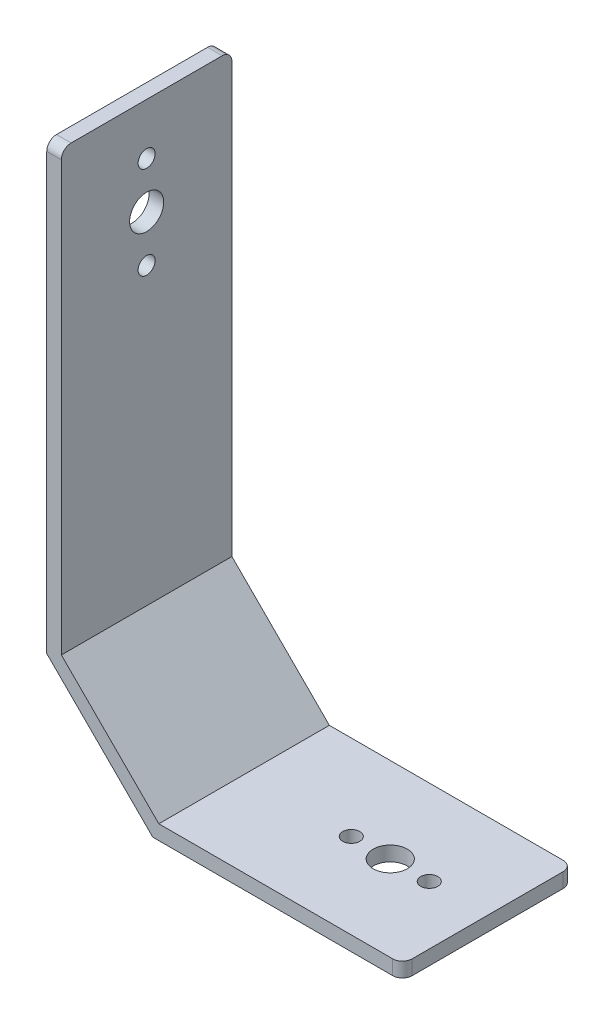
ISO-10303-21;
HEADER;
FILE_DESCRIPTION(('STEP AP214'),'2;1');
FILE_NAME('part.step','',(''),(''),'','','');
FILE_SCHEMA(('AUTOMOTIVE_DESIGN { 1 0 10303 214 1 1 1 1 }'));
ENDSEC;
DATA;
#1=APPLICATION_CONTEXT('core data for automotive mechanical design processes');
#2=APPLICATION_PROTOCOL_DEFINITION('international standard','automotive_design',2000,#1);
#3=PRODUCT_CONTEXT('',#1,'mechanical');
#4=PRODUCT('Part','Part','',(#3));
#5=PRODUCT_RELATED_PRODUCT_CATEGORY('part','',(#4));
#6=PRODUCT_DEFINITION_FORMATION('','',#4);
#7=PRODUCT_DEFINITION_CONTEXT('part definition',#1,'design');
#8=PRODUCT_DEFINITION('design','',#6,#7);
#9=PRODUCT_DEFINITION_SHAPE('','',#8);
#10=(LENGTH_UNIT() NAMED_UNIT(*) SI_UNIT(.MILLI.,.METRE.));
#11=(NAMED_UNIT(*) PLANE_ANGLE_UNIT() SI_UNIT($,.RADIAN.));
#12=(NAMED_UNIT(*) SI_UNIT($,.STERADIAN.) SOLID_ANGLE_UNIT());
#13=UNCERTAINTY_MEASURE_WITH_UNIT(LENGTH_MEASURE(1.E-05),#10,'distance_accuracy_value','');
#14=(GEOMETRIC_REPRESENTATION_CONTEXT(3) GLOBAL_UNCERTAINTY_ASSIGNED_CONTEXT((#13)) GLOBAL_UNIT_ASSIGNED_CONTEXT((#10,
#11,#12)) REPRESENTATION_CONTEXT('',''));
#15=CARTESIAN_POINT('',(0.,0.,0.));
#16=DIRECTION('',(0.,0.,1.));
#17=DIRECTION('',(1.,0.,0.));
#18=AXIS2_PLACEMENT_3D('',#15,#16,#17);
#19=CARTESIAN_POINT('',(20.,-23.,35.));
#20=DIRECTION('',(0.,1.,0.));
#21=DIRECTION('',(0.,0.,1.));
#22=AXIS2_PLACEMENT_3D('',#19,#20,#21);
#23=PLANE('',#22);
#24=CARTESIAN_POINT('',(50.,-23.,17.5));
#25=DIRECTION('',(0.,1.,0.));
#26=DIRECTION('',(0.,0.,1.));
#27=AXIS2_PLACEMENT_3D('',#24,#25,#26);
#28=CIRCLE('',#27,3.5);
#29=CARTESIAN_POINT('',(50.,-23.,21.));
#30=VERTEX_POINT('',#29);
#31=EDGE_CURVE('E312',#30,#30,#28,.T.);
#32=ORIENTED_EDGE('',*,*,#31,.T.);
#33=EDGE_LOOP('',(#32));
#34=FACE_BOUND('',#33,.T.);
#35=CARTESIAN_POINT('',(42.,-23.,17.5));
#36=DIRECTION('',(0.,1.,0.));
#37=DIRECTION('',(0.,0.,1.));
#38=AXIS2_PLACEMENT_3D('',#35,#36,#37);
#39=CIRCLE('',#38,1.75);
#40=CARTESIAN_POINT('',(42.,-23.,19.25));
#41=VERTEX_POINT('',#40);
#42=EDGE_CURVE('E306',#41,#41,#39,.T.);
#43=ORIENTED_EDGE('',*,*,#42,.T.);
#44=EDGE_LOOP('',(#43));
#45=FACE_BOUND('',#44,.T.);
#46=CARTESIAN_POINT('',(58.,-23.,17.5));
#47=DIRECTION('',(0.,1.,0.));
#48=DIRECTION('',(0.,0.,1.));
#49=AXIS2_PLACEMENT_3D('',#46,#47,#48);
#50=CIRCLE('',#49,1.75);
#51=CARTESIAN_POINT('',(58.,-23.,19.25));
#52=VERTEX_POINT('',#51);
#53=EDGE_CURVE('E299',#52,#52,#50,.T.);
#54=ORIENTED_EDGE('',*,*,#53,.T.);
#55=EDGE_LOOP('',(#54));
#56=FACE_BOUND('',#55,.T.);
#57=DIRECTION('',(1.,0.,0.));
#58=VECTOR('',#57,1.);
#59=CARTESIAN_POINT('',(20.,-23.,0.));
#60=LINE('',#59,#58);
#61=CARTESIAN_POINT('',(18.7573593128807,-23.,0.));
#62=VERTEX_POINT('',#61);
#63=CARTESIAN_POINT('',(68.,-23.,0.));
#64=VERTEX_POINT('',#63);
#65=EDGE_CURVE('E158',#62,#64,#60,.T.);
#66=ORIENTED_EDGE('',*,*,#65,.T.);
#67=CARTESIAN_POINT('',(68.,-23.,2.));
#68=DIRECTION('',(0.,1.,0.));
#69=DIRECTION('',(0.,0.,1.));
#70=AXIS2_PLACEMENT_3D('',#67,#68,#69);
#71=CIRCLE('',#70,2.);
#72=CARTESIAN_POINT('',(70.,-23.,2.));
#73=VERTEX_POINT('',#72);
#74=EDGE_CURVE('E54',#64,#73,#71,.F.);
#75=ORIENTED_EDGE('',*,*,#74,.T.);
#76=DIRECTION('',(0.,0.,-1.));
#77=VECTOR('',#76,1.);
#78=CARTESIAN_POINT('',(70.,-23.,35.));
#79=LINE('',#78,#77);
#80=CARTESIAN_POINT('',(70.,-23.,33.));
#81=VERTEX_POINT('',#80);
#82=EDGE_CURVE('E183',#81,#73,#79,.T.);
#83=ORIENTED_EDGE('',*,*,#82,.F.);
#84=CARTESIAN_POINT('',(68.,-23.,33.));
#85=DIRECTION('',(0.,1.,0.));
#86=DIRECTION('',(0.,0.,1.));
#87=AXIS2_PLACEMENT_3D('',#84,#85,#86);
#88=CIRCLE('',#87,2.);
#89=CARTESIAN_POINT('',(68.,-23.,35.));
#90=VERTEX_POINT('',#89);
#91=EDGE_CURVE('E206',#81,#90,#88,.F.);
#92=ORIENTED_EDGE('',*,*,#91,.T.);
#93=DIRECTION('',(1.,0.,0.));
#94=VECTOR('',#93,1.);
#95=CARTESIAN_POINT('',(20.,-23.,35.));
#96=LINE('',#95,#94);
#97=CARTESIAN_POINT('',(18.7573593128807,-23.,35.));
#98=VERTEX_POINT('',#97);
#99=EDGE_CURVE('E143',#98,#90,#96,.T.);
#100=ORIENTED_EDGE('',*,*,#99,.F.);
#101=DIRECTION('',(0.,0.,-1.));
#102=VECTOR('',#101,1.);
#103=CARTESIAN_POINT('',(18.7573593128807,-23.,35.));
#104=LINE('',#103,#102);
#105=EDGE_CURVE('E157',#98,#62,#104,.T.);
#106=ORIENTED_EDGE('',*,*,#105,.T.);
#107=EDGE_LOOP('',(#66,#75,#83,#92,#100,#106));
#108=FACE_BOUND('',#107,.T.);
#109=ADVANCED_FACE('F32',(#34,#45,#56,#108),#23,.F.);
#110=CARTESIAN_POINT('',(70.,-20.,35.));
#111=DIRECTION('',(1.,0.,0.));
#112=DIRECTION('',(0.,0.,-1.));
#113=AXIS2_PLACEMENT_3D('',#110,#111,#112);
#114=PLANE('',#113);
#115=ORIENTED_EDGE('',*,*,#82,.T.);
#116=DIRECTION('',(0.,-1.,0.));
#117=VECTOR('',#116,1.);
#118=CARTESIAN_POINT('',(70.,-20.,2.));
#119=LINE('',#118,#117);
#120=CARTESIAN_POINT('',(70.,-20.,2.));
#121=VERTEX_POINT('',#120);
#122=EDGE_CURVE('E40',#73,#121,#119,.F.);
#123=ORIENTED_EDGE('',*,*,#122,.T.);
#124=DIRECTION('',(0.,0.,-1.));
#125=VECTOR('',#124,1.);
#126=CARTESIAN_POINT('',(70.,-20.,35.));
#127=LINE('',#126,#125);
#128=CARTESIAN_POINT('',(70.,-20.,33.));
#129=VERTEX_POINT('',#128);
#130=EDGE_CURVE('E132',#129,#121,#127,.T.);
#131=ORIENTED_EDGE('',*,*,#130,.F.);
#132=DIRECTION('',(0.,-1.,0.));
#133=VECTOR('',#132,1.);
#134=CARTESIAN_POINT('',(70.,-23.,33.));
#135=LINE('',#134,#133);
#136=EDGE_CURVE('E203',#129,#81,#135,.T.);
#137=ORIENTED_EDGE('',*,*,#136,.T.);
#138=EDGE_LOOP('',(#115,#123,#131,#137));
#139=FACE_BOUND('',#138,.T.);
#140=ADVANCED_FACE('F260',(#139),#114,.T.);
#141=CARTESIAN_POINT('',(20.,-20.,35.));
#142=DIRECTION('',(0.,1.,0.));
#143=DIRECTION('',(0.,0.,1.));
#144=AXIS2_PLACEMENT_3D('',#141,#142,#143);
#145=PLANE('',#144);
#146=CARTESIAN_POINT('',(50.,-20.,17.5));
#147=DIRECTION('',(0.,1.,0.));
#148=DIRECTION('',(0.,0.,1.));
#149=AXIS2_PLACEMENT_3D('',#146,#147,#148);
#150=CIRCLE('',#149,3.5);
#151=CARTESIAN_POINT('',(50.,-20.,21.));
#152=VERTEX_POINT('',#151);
#153=EDGE_CURVE('E314',#152,#152,#150,.T.);
#154=ORIENTED_EDGE('',*,*,#153,.F.);
#155=EDGE_LOOP('',(#154));
#156=FACE_BOUND('',#155,.T.);
#157=CARTESIAN_POINT('',(42.,-20.,17.5));
#158=DIRECTION('',(0.,1.,0.));
#159=DIRECTION('',(0.,0.,1.));
#160=AXIS2_PLACEMENT_3D('',#157,#158,#159);
#161=CIRCLE('',#160,1.75);
#162=CARTESIAN_POINT('',(42.,-20.,19.25));
#163=VERTEX_POINT('',#162);
#164=EDGE_CURVE('E309',#163,#163,#161,.T.);
#165=ORIENTED_EDGE('',*,*,#164,.F.);
#166=EDGE_LOOP('',(#165));
#167=FACE_BOUND('',#166,.T.);
#168=CARTESIAN_POINT('',(58.,-20.,17.5));
#169=DIRECTION('',(0.,1.,0.));
#170=DIRECTION('',(0.,0.,1.));
#171=AXIS2_PLACEMENT_3D('',#168,#169,#170);
#172=CIRCLE('',#171,1.75);
#173=CARTESIAN_POINT('',(58.,-20.,19.25));
#174=VERTEX_POINT('',#173);
#175=EDGE_CURVE('E303',#174,#174,#172,.T.);
#176=ORIENTED_EDGE('',*,*,#175,.F.);
#177=EDGE_LOOP('',(#176));
#178=FACE_BOUND('',#177,.T.);
#179=ORIENTED_EDGE('',*,*,#130,.T.);
#180=CARTESIAN_POINT('',(68.,-20.,2.));
#181=DIRECTION('',(0.,1.,0.));
#182=DIRECTION('',(0.,0.,1.));
#183=AXIS2_PLACEMENT_3D('',#180,#181,#182);
#184=CIRCLE('',#183,2.);
#185=CARTESIAN_POINT('',(68.,-20.,0.));
#186=VERTEX_POINT('',#185);
#187=EDGE_CURVE('E11',#121,#186,#184,.T.);
#188=ORIENTED_EDGE('',*,*,#187,.T.);
#189=DIRECTION('',(1.,0.,0.));
#190=VECTOR('',#189,1.);
#191=CARTESIAN_POINT('',(20.,-20.,0.));
#192=LINE('',#191,#190);
#193=CARTESIAN_POINT('',(20.,-20.,0.));
#194=VERTEX_POINT('',#193);
#195=EDGE_CURVE('E127',#194,#186,#192,.T.);
#196=ORIENTED_EDGE('',*,*,#195,.F.);
#197=DIRECTION('',(0.,0.,-1.));
#198=VECTOR('',#197,1.);
#199=CARTESIAN_POINT('',(20.,-20.,35.));
#200=LINE('',#199,#198);
#201=CARTESIAN_POINT('',(20.,-20.,35.));
#202=VERTEX_POINT('',#201);
#203=EDGE_CURVE('E121',#202,#194,#200,.T.);
#204=ORIENTED_EDGE('',*,*,#203,.F.);
#205=DIRECTION('',(1.,0.,0.));
#206=VECTOR('',#205,1.);
#207=CARTESIAN_POINT('',(20.,-20.,35.));
#208=LINE('',#207,#206);
#209=CARTESIAN_POINT('',(68.,-20.,35.));
#210=VERTEX_POINT('',#209);
#211=EDGE_CURVE('E124',#202,#210,#208,.T.);
#212=ORIENTED_EDGE('',*,*,#211,.T.);
#213=CARTESIAN_POINT('',(68.,-20.,33.));
#214=DIRECTION('',(0.,1.,0.));
#215=DIRECTION('',(0.,0.,1.));
#216=AXIS2_PLACEMENT_3D('',#213,#214,#215);
#217=CIRCLE('',#216,2.);
#218=EDGE_CURVE('E209',#210,#129,#217,.T.);
#219=ORIENTED_EDGE('',*,*,#218,.T.);
#220=EDGE_LOOP('',(#179,#188,#196,#204,#212,#219));
#221=FACE_BOUND('',#220,.T.);
#222=ADVANCED_FACE('F123',(#156,#167,#178,#221),#145,.T.);
#223=CARTESIAN_POINT('',(0.,0.,35.));
#224=DIRECTION('',(0.707106781186548,0.707106781186548,0.));
#225=DIRECTION('',(-0.707106781186548,0.707106781186547,0.));
#226=AXIS2_PLACEMENT_3D('',#223,#224,#225);
#227=PLANE('',#226);
#228=DIRECTION('',(0.707106781186548,-0.707106781186547,0.));
#229=VECTOR('',#228,1.);
#230=CARTESIAN_POINT('',(0.,0.,0.));
#231=LINE('',#230,#229);
#232=CARTESIAN_POINT('',(0.,0.,0.));
#233=VERTEX_POINT('',#232);
#234=EDGE_CURVE('E162',#233,#194,#231,.T.);
#235=ORIENTED_EDGE('',*,*,#234,.F.);
#236=DIRECTION('',(0.,0.,-1.));
#237=VECTOR('',#236,1.);
#238=CARTESIAN_POINT('',(0.,0.,35.));
#239=LINE('',#238,#237);
#240=CARTESIAN_POINT('',(0.,0.,35.));
#241=VERTEX_POINT('',#240);
#242=EDGE_CURVE('E133',#241,#233,#239,.T.);
#243=ORIENTED_EDGE('',*,*,#242,.F.);
#244=DIRECTION('',(0.707106781186548,-0.707106781186547,0.));
#245=VECTOR('',#244,1.);
#246=CARTESIAN_POINT('',(0.,0.,35.));
#247=LINE('',#246,#245);
#248=EDGE_CURVE('E140',#241,#202,#247,.T.);
#249=ORIENTED_EDGE('',*,*,#248,.T.);
#250=ORIENTED_EDGE('',*,*,#203,.T.);
#251=EDGE_LOOP('',(#235,#243,#249,#250));
#252=FACE_BOUND('',#251,.T.);
#253=ADVANCED_FACE('F146',(#252),#227,.T.);
#254=CARTESIAN_POINT('',(0.,0.,35.));
#255=DIRECTION('',(1.,0.,0.));
#256=DIRECTION('',(0.,0.,-1.));
#257=AXIS2_PLACEMENT_3D('',#254,#255,#256);
#258=PLANE('',#257);
#259=CARTESIAN_POINT('',(0.,70.,17.5));
#260=DIRECTION('',(1.,0.,0.));
#261=DIRECTION('',(0.,0.,-1.));
#262=AXIS2_PLACEMENT_3D('',#259,#260,#261);
#263=CIRCLE('',#262,3.5);
#264=CARTESIAN_POINT('',(0.,70.,14.));
#265=VERTEX_POINT('',#264);
#266=EDGE_CURVE('E296',#265,#265,#263,.T.);
#267=ORIENTED_EDGE('',*,*,#266,.F.);
#268=EDGE_LOOP('',(#267));
#269=FACE_BOUND('',#268,.T.);
#270=CARTESIAN_POINT('',(0.,60.5,17.5));
#271=DIRECTION('',(1.,0.,0.));
#272=DIRECTION('',(0.,0.,-1.));
#273=AXIS2_PLACEMENT_3D('',#270,#271,#272);
#274=CIRCLE('',#273,1.75);
#275=CARTESIAN_POINT('',(0.,60.5,15.75));
#276=VERTEX_POINT('',#275);
#277=EDGE_CURVE('E290',#276,#276,#274,.T.);
#278=ORIENTED_EDGE('',*,*,#277,.F.);
#279=EDGE_LOOP('',(#278));
#280=FACE_BOUND('',#279,.T.);
#281=CARTESIAN_POINT('',(0.,79.5,17.5));
#282=DIRECTION('',(1.,0.,0.));
#283=DIRECTION('',(0.,0.,-1.));
#284=AXIS2_PLACEMENT_3D('',#281,#282,#283);
#285=CIRCLE('',#284,1.75);
#286=CARTESIAN_POINT('',(0.,79.5,15.75));
#287=VERTEX_POINT('',#286);
#288=EDGE_CURVE('E284',#287,#287,#285,.T.);
#289=ORIENTED_EDGE('',*,*,#288,.F.);
#290=EDGE_LOOP('',(#289));
#291=FACE_BOUND('',#290,.T.);
#292=DIRECTION('',(0.,-1.,0.));
#293=VECTOR('',#292,1.);
#294=CARTESIAN_POINT('',(0.,0.,0.));
#295=LINE('',#294,#293);
#296=CARTESIAN_POINT('',(0.,88.,0.));
#297=VERTEX_POINT('',#296);
#298=EDGE_CURVE('E164',#297,#233,#295,.T.);
#299=ORIENTED_EDGE('',*,*,#298,.F.);
#300=CARTESIAN_POINT('',(0.,88.,2.));
#301=DIRECTION('',(1.,0.,0.));
#302=DIRECTION('',(0.,0.,-1.));
#303=AXIS2_PLACEMENT_3D('',#300,#301,#302);
#304=CIRCLE('',#303,2.);
#305=CARTESIAN_POINT('',(0.,90.,2.));
#306=VERTEX_POINT('',#305);
#307=EDGE_CURVE('E197',#297,#306,#304,.T.);
#308=ORIENTED_EDGE('',*,*,#307,.T.);
#309=DIRECTION('',(0.,0.,-1.));
#310=VECTOR('',#309,1.);
#311=CARTESIAN_POINT('',(0.,90.,35.));
#312=LINE('',#311,#310);
#313=CARTESIAN_POINT('',(0.,90.,33.));
#314=VERTEX_POINT('',#313);
#315=EDGE_CURVE('E178',#314,#306,#312,.T.);
#316=ORIENTED_EDGE('',*,*,#315,.F.);
#317=CARTESIAN_POINT('',(0.,88.,33.));
#318=DIRECTION('',(1.,0.,0.));
#319=DIRECTION('',(0.,0.,-1.));
#320=AXIS2_PLACEMENT_3D('',#317,#318,#319);
#321=CIRCLE('',#320,2.);
#322=CARTESIAN_POINT('',(0.,88.,35.));
#323=VERTEX_POINT('',#322);
#324=EDGE_CURVE('E188',#314,#323,#321,.T.);
#325=ORIENTED_EDGE('',*,*,#324,.T.);
#326=DIRECTION('',(0.,-1.,0.));
#327=VECTOR('',#326,1.);
#328=CARTESIAN_POINT('',(0.,0.,35.));
#329=LINE('',#328,#327);
#330=EDGE_CURVE('E148',#323,#241,#329,.T.);
#331=ORIENTED_EDGE('',*,*,#330,.T.);
#332=ORIENTED_EDGE('',*,*,#242,.T.);
#333=EDGE_LOOP('',(#299,#308,#316,#325,#331,#332));
#334=FACE_BOUND('',#333,.T.);
#335=ADVANCED_FACE('F237',(#269,#280,#291,#334),#258,.T.);
#336=CARTESIAN_POINT('',(-3.,90.,35.));
#337=DIRECTION('',(0.,1.,0.));
#338=DIRECTION('',(0.,0.,1.));
#339=AXIS2_PLACEMENT_3D('',#336,#337,#338);
#340=PLANE('',#339);
#341=ORIENTED_EDGE('',*,*,#315,.T.);
#342=DIRECTION('',(1.,0.,0.));
#343=VECTOR('',#342,1.);
#344=CARTESIAN_POINT('',(-3.,90.,2.));
#345=LINE('',#344,#343);
#346=CARTESIAN_POINT('',(-3.,90.,2.));
#347=VERTEX_POINT('',#346);
#348=EDGE_CURVE('E199',#306,#347,#345,.F.);
#349=ORIENTED_EDGE('',*,*,#348,.T.);
#350=DIRECTION('',(0.,0.,-1.));
#351=VECTOR('',#350,1.);
#352=CARTESIAN_POINT('',(-3.,90.,35.));
#353=LINE('',#352,#351);
#354=CARTESIAN_POINT('',(-3.,90.,33.));
#355=VERTEX_POINT('',#354);
#356=EDGE_CURVE('E175',#355,#347,#353,.T.);
#357=ORIENTED_EDGE('',*,*,#356,.F.);
#358=DIRECTION('',(1.,0.,0.));
#359=VECTOR('',#358,1.);
#360=CARTESIAN_POINT('',(0.,90.,33.));
#361=LINE('',#360,#359);
#362=EDGE_CURVE('E185',#355,#314,#361,.T.);
#363=ORIENTED_EDGE('',*,*,#362,.T.);
#364=EDGE_LOOP('',(#341,#349,#357,#363));
#365=FACE_BOUND('',#364,.T.);
#366=ADVANCED_FACE('F239',(#365),#340,.T.);
#367=CARTESIAN_POINT('',(-3.,0.,35.));
#368=DIRECTION('',(1.,0.,0.));
#369=DIRECTION('',(0.,0.,-1.));
#370=AXIS2_PLACEMENT_3D('',#367,#368,#369);
#371=PLANE('',#370);
#372=CARTESIAN_POINT('',(-3.,70.,17.5));
#373=DIRECTION('',(1.,0.,0.));
#374=DIRECTION('',(0.,0.,-1.));
#375=AXIS2_PLACEMENT_3D('',#372,#373,#374);
#376=CIRCLE('',#375,3.5);
#377=CARTESIAN_POINT('',(-3.,70.,14.));
#378=VERTEX_POINT('',#377);
#379=EDGE_CURVE('E293',#378,#378,#376,.T.);
#380=ORIENTED_EDGE('',*,*,#379,.T.);
#381=EDGE_LOOP('',(#380));
#382=FACE_BOUND('',#381,.T.);
#383=CARTESIAN_POINT('',(-3.,60.5,17.5));
#384=DIRECTION('',(1.,0.,0.));
#385=DIRECTION('',(0.,0.,-1.));
#386=AXIS2_PLACEMENT_3D('',#383,#384,#385);
#387=CIRCLE('',#386,1.75);
#388=CARTESIAN_POINT('',(-3.,60.5,15.75));
#389=VERTEX_POINT('',#388);
#390=EDGE_CURVE('E287',#389,#389,#387,.T.);
#391=ORIENTED_EDGE('',*,*,#390,.T.);
#392=EDGE_LOOP('',(#391));
#393=FACE_BOUND('',#392,.T.);
#394=CARTESIAN_POINT('',(-3.,79.5,17.5));
#395=DIRECTION('',(1.,0.,0.));
#396=DIRECTION('',(0.,0.,-1.));
#397=AXIS2_PLACEMENT_3D('',#394,#395,#396);
#398=CIRCLE('',#397,1.75);
#399=CARTESIAN_POINT('',(-3.,79.5,15.75));
#400=VERTEX_POINT('',#399);
#401=EDGE_CURVE('E160',#400,#400,#398,.T.);
#402=ORIENTED_EDGE('',*,*,#401,.T.);
#403=EDGE_LOOP('',(#402));
#404=FACE_BOUND('',#403,.T.);
#405=ORIENTED_EDGE('',*,*,#356,.T.);
#406=CARTESIAN_POINT('',(-3.,88.,2.));
#407=DIRECTION('',(1.,0.,0.));
#408=DIRECTION('',(0.,0.,-1.));
#409=AXIS2_PLACEMENT_3D('',#406,#407,#408);
#410=CIRCLE('',#409,2.);
#411=CARTESIAN_POINT('',(-3.,88.,0.));
#412=VERTEX_POINT('',#411);
#413=EDGE_CURVE('E201',#347,#412,#410,.F.);
#414=ORIENTED_EDGE('',*,*,#413,.T.);
#415=DIRECTION('',(0.,1.,0.));
#416=VECTOR('',#415,1.);
#417=CARTESIAN_POINT('',(-3.,0.,0.));
#418=LINE('',#417,#416);
#419=CARTESIAN_POINT('',(-3.,-1.24264068711929,0.));
#420=VERTEX_POINT('',#419);
#421=EDGE_CURVE('E166',#412,#420,#418,.F.);
#422=ORIENTED_EDGE('',*,*,#421,.T.);
#423=DIRECTION('',(0.,0.,-1.));
#424=VECTOR('',#423,1.);
#425=CARTESIAN_POINT('',(-3.,-1.24264068711929,35.));
#426=LINE('',#425,#424);
#427=CARTESIAN_POINT('',(-3.,-1.24264068711929,35.));
#428=VERTEX_POINT('',#427);
#429=EDGE_CURVE('E172',#428,#420,#426,.T.);
#430=ORIENTED_EDGE('',*,*,#429,.F.);
#431=DIRECTION('',(0.,1.,0.));
#432=VECTOR('',#431,1.);
#433=CARTESIAN_POINT('',(-3.,0.,35.));
#434=LINE('',#433,#432);
#435=CARTESIAN_POINT('',(-3.,88.,35.));
#436=VERTEX_POINT('',#435);
#437=EDGE_CURVE('E150',#436,#428,#434,.F.);
#438=ORIENTED_EDGE('',*,*,#437,.F.);
#439=CARTESIAN_POINT('',(-3.,88.,33.));
#440=DIRECTION('',(1.,0.,0.));
#441=DIRECTION('',(0.,0.,-1.));
#442=AXIS2_PLACEMENT_3D('',#439,#440,#441);
#443=CIRCLE('',#442,2.);
#444=EDGE_CURVE('E192',#436,#355,#443,.F.);
#445=ORIENTED_EDGE('',*,*,#444,.T.);
#446=EDGE_LOOP('',(#405,#414,#422,#430,#438,#445));
#447=FACE_BOUND('',#446,.T.);
#448=ADVANCED_FACE('F247',(#382,#393,#404,#447),#371,.F.);
#449=CARTESIAN_POINT('',(-2.12132034355964,-2.12132034355964,35.));
#450=DIRECTION('',(0.707106781186548,0.707106781186548,0.));
#451=DIRECTION('',(-0.707106781186548,0.707106781186547,0.));
#452=AXIS2_PLACEMENT_3D('',#449,#450,#451);
#453=PLANE('',#452);
#454=DIRECTION('',(0.707106781186548,-0.707106781186547,0.));
#455=VECTOR('',#454,1.);
#456=CARTESIAN_POINT('',(-2.12132034355964,-2.12132034355964,0.));
#457=LINE('',#456,#455);
#458=EDGE_CURVE('E168',#420,#62,#457,.T.);
#459=ORIENTED_EDGE('',*,*,#458,.T.);
#460=ORIENTED_EDGE('',*,*,#105,.F.);
#461=DIRECTION('',(0.707106781186548,-0.707106781186547,0.));
#462=VECTOR('',#461,1.);
#463=CARTESIAN_POINT('',(-2.12132034355964,-2.12132034355964,35.));
#464=LINE('',#463,#462);
#465=EDGE_CURVE('E155',#428,#98,#464,.T.);
#466=ORIENTED_EDGE('',*,*,#465,.F.);
#467=ORIENTED_EDGE('',*,*,#429,.T.);
#468=EDGE_LOOP('',(#459,#460,#466,#467));
#469=FACE_BOUND('',#468,.T.);
#470=ADVANCED_FACE('F225',(#469),#453,.F.);
#471=CARTESIAN_POINT('',(0.,0.,35.));
#472=DIRECTION('',(0.,0.,-1.));
#473=DIRECTION('',(-1.,0.,0.));
#474=AXIS2_PLACEMENT_3D('',#471,#472,#473);
#475=PLANE('',#474);
#476=ORIENTED_EDGE('',*,*,#99,.T.);
#477=DIRECTION('',(0.,-1.,0.));
#478=VECTOR('',#477,1.);
#479=CARTESIAN_POINT('',(68.,-20.,35.));
#480=LINE('',#479,#478);
#481=EDGE_CURVE('E142',#90,#210,#480,.F.);
#482=ORIENTED_EDGE('',*,*,#481,.T.);
#483=ORIENTED_EDGE('',*,*,#211,.F.);
#484=ORIENTED_EDGE('',*,*,#248,.F.);
#485=ORIENTED_EDGE('',*,*,#330,.F.);
#486=DIRECTION('',(1.,0.,0.));
#487=VECTOR('',#486,1.);
#488=CARTESIAN_POINT('',(-3.,88.,35.));
#489=LINE('',#488,#487);
#490=EDGE_CURVE('E190',#323,#436,#489,.F.);
#491=ORIENTED_EDGE('',*,*,#490,.T.);
#492=ORIENTED_EDGE('',*,*,#437,.T.);
#493=ORIENTED_EDGE('',*,*,#465,.T.);
#494=EDGE_LOOP('',(#476,#482,#483,#484,#485,#491,#492,#493));
#495=FACE_BOUND('',#494,.T.);
#496=ADVANCED_FACE('F138',(#495),#475,.F.);
#497=CARTESIAN_POINT('',(0.,0.,0.));
#498=DIRECTION('',(0.,0.,-1.));
#499=DIRECTION('',(-1.,0.,0.));
#500=AXIS2_PLACEMENT_3D('',#497,#498,#499);
#501=PLANE('',#500);
#502=ORIENTED_EDGE('',*,*,#195,.T.);
#503=DIRECTION('',(0.,-1.,0.));
#504=VECTOR('',#503,1.);
#505=CARTESIAN_POINT('',(68.,0.,0.));
#506=LINE('',#505,#504);
#507=EDGE_CURVE('E211',#186,#64,#506,.T.);
#508=ORIENTED_EDGE('',*,*,#507,.T.);
#509=ORIENTED_EDGE('',*,*,#65,.F.);
#510=ORIENTED_EDGE('',*,*,#458,.F.);
#511=ORIENTED_EDGE('',*,*,#421,.F.);
#512=DIRECTION('',(1.,0.,0.));
#513=VECTOR('',#512,1.);
#514=CARTESIAN_POINT('',(0.,88.,0.));
#515=LINE('',#514,#513);
#516=EDGE_CURVE('E194',#412,#297,#515,.T.);
#517=ORIENTED_EDGE('',*,*,#516,.T.);
#518=ORIENTED_EDGE('',*,*,#298,.T.);
#519=ORIENTED_EDGE('',*,*,#234,.T.);
#520=EDGE_LOOP('',(#502,#508,#509,#510,#511,#517,#518,#519));
#521=FACE_BOUND('',#520,.T.);
#522=ADVANCED_FACE('F217',(#521),#501,.T.);
#523=CARTESIAN_POINT('',(-3.,79.5,17.5));
#524=DIRECTION('',(1.,0.,0.));
#525=DIRECTION('',(0.,0.,-1.));
#526=AXIS2_PLACEMENT_3D('',#523,#524,#525);
#527=CYLINDRICAL_SURFACE('',#526,1.75);
#528=ORIENTED_EDGE('',*,*,#401,.F.);
#529=EDGE_LOOP('',(#528));
#530=FACE_BOUND('',#529,.T.);
#531=ORIENTED_EDGE('',*,*,#288,.T.);
#532=EDGE_LOOP('',(#531));
#533=FACE_BOUND('',#532,.T.);
#534=ADVANCED_FACE('F346',(#530,#533),#527,.F.);
#535=CARTESIAN_POINT('',(-3.,60.5,17.5));
#536=DIRECTION('',(1.,0.,0.));
#537=DIRECTION('',(0.,0.,-1.));
#538=AXIS2_PLACEMENT_3D('',#535,#536,#537);
#539=CYLINDRICAL_SURFACE('',#538,1.75);
#540=ORIENTED_EDGE('',*,*,#390,.F.);
#541=EDGE_LOOP('',(#540));
#542=FACE_BOUND('',#541,.T.);
#543=ORIENTED_EDGE('',*,*,#277,.T.);
#544=EDGE_LOOP('',(#543));
#545=FACE_BOUND('',#544,.T.);
#546=ADVANCED_FACE('F342',(#542,#545),#539,.F.);
#547=CARTESIAN_POINT('',(-3.,70.,17.5));
#548=DIRECTION('',(1.,0.,0.));
#549=DIRECTION('',(0.,0.,-1.));
#550=AXIS2_PLACEMENT_3D('',#547,#548,#549);
#551=CYLINDRICAL_SURFACE('',#550,3.5);
#552=ORIENTED_EDGE('',*,*,#379,.F.);
#553=EDGE_LOOP('',(#552));
#554=FACE_BOUND('',#553,.T.);
#555=ORIENTED_EDGE('',*,*,#266,.T.);
#556=EDGE_LOOP('',(#555));
#557=FACE_BOUND('',#556,.T.);
#558=ADVANCED_FACE('F273',(#554,#557),#551,.F.);
#559=CARTESIAN_POINT('',(-3.,88.,33.));
#560=DIRECTION('',(-1.,0.,0.));
#561=DIRECTION('',(0.,0.,1.));
#562=AXIS2_PLACEMENT_3D('',#559,#560,#561);
#563=CYLINDRICAL_SURFACE('',#562,2.);
#564=ORIENTED_EDGE('',*,*,#444,.F.);
#565=ORIENTED_EDGE('',*,*,#490,.F.);
#566=ORIENTED_EDGE('',*,*,#324,.F.);
#567=ORIENTED_EDGE('',*,*,#362,.F.);
#568=EDGE_LOOP('',(#564,#565,#566,#567));
#569=FACE_BOUND('',#568,.T.);
#570=ADVANCED_FACE('F244',(#569),#563,.T.);
#571=CARTESIAN_POINT('',(0.,88.,2.));
#572=DIRECTION('',(1.,0.,0.));
#573=DIRECTION('',(0.,0.,-1.));
#574=AXIS2_PLACEMENT_3D('',#571,#572,#573);
#575=CYLINDRICAL_SURFACE('',#574,2.);
#576=ORIENTED_EDGE('',*,*,#413,.F.);
#577=ORIENTED_EDGE('',*,*,#348,.F.);
#578=ORIENTED_EDGE('',*,*,#307,.F.);
#579=ORIENTED_EDGE('',*,*,#516,.F.);
#580=EDGE_LOOP('',(#576,#577,#578,#579));
#581=FACE_BOUND('',#580,.T.);
#582=ADVANCED_FACE('F233',(#581),#575,.T.);
#583=CARTESIAN_POINT('',(68.,-20.,33.));
#584=DIRECTION('',(0.,1.,0.));
#585=DIRECTION('',(0.,0.,1.));
#586=AXIS2_PLACEMENT_3D('',#583,#584,#585);
#587=CYLINDRICAL_SURFACE('',#586,2.);
#588=ORIENTED_EDGE('',*,*,#218,.F.);
#589=ORIENTED_EDGE('',*,*,#481,.F.);
#590=ORIENTED_EDGE('',*,*,#91,.F.);
#591=ORIENTED_EDGE('',*,*,#136,.F.);
#592=EDGE_LOOP('',(#588,#589,#590,#591));
#593=FACE_BOUND('',#592,.T.);
#594=ADVANCED_FACE('F275',(#593),#587,.T.);
#595=CARTESIAN_POINT('',(68.,0.,2.));
#596=DIRECTION('',(0.,-1.,0.));
#597=DIRECTION('',(0.,0.,-1.));
#598=AXIS2_PLACEMENT_3D('',#595,#596,#597);
#599=CYLINDRICAL_SURFACE('',#598,2.);
#600=ORIENTED_EDGE('',*,*,#187,.F.);
#601=ORIENTED_EDGE('',*,*,#122,.F.);
#602=ORIENTED_EDGE('',*,*,#74,.F.);
#603=ORIENTED_EDGE('',*,*,#507,.F.);
#604=EDGE_LOOP('',(#600,#601,#602,#603));
#605=FACE_BOUND('',#604,.T.);
#606=ADVANCED_FACE('F34',(#605),#599,.T.);
#607=CARTESIAN_POINT('',(58.,-30.,17.5));
#608=DIRECTION('',(0.,1.,0.));
#609=DIRECTION('',(0.,0.,1.));
#610=AXIS2_PLACEMENT_3D('',#607,#608,#609);
#611=CYLINDRICAL_SURFACE('',#610,1.75);
#612=ORIENTED_EDGE('',*,*,#175,.T.);
#613=EDGE_LOOP('',(#612));
#614=FACE_BOUND('',#613,.T.);
#615=ORIENTED_EDGE('',*,*,#53,.F.);
#616=EDGE_LOOP('',(#615));
#617=FACE_BOUND('',#616,.T.);
#618=ADVANCED_FACE('F281',(#614,#617),#611,.F.);
#619=CARTESIAN_POINT('',(42.,-30.,17.5));
#620=DIRECTION('',(0.,1.,0.));
#621=DIRECTION('',(0.,0.,1.));
#622=AXIS2_PLACEMENT_3D('',#619,#620,#621);
#623=CYLINDRICAL_SURFACE('',#622,1.75);
#624=ORIENTED_EDGE('',*,*,#164,.T.);
#625=EDGE_LOOP('',(#624));
#626=FACE_BOUND('',#625,.T.);
#627=ORIENTED_EDGE('',*,*,#42,.F.);
#628=EDGE_LOOP('',(#627));
#629=FACE_BOUND('',#628,.T.);
#630=ADVANCED_FACE('F329',(#626,#629),#623,.F.);
#631=CARTESIAN_POINT('',(50.,-30.,17.5));
#632=DIRECTION('',(0.,1.,0.));
#633=DIRECTION('',(0.,0.,1.));
#634=AXIS2_PLACEMENT_3D('',#631,#632,#633);
#635=CYLINDRICAL_SURFACE('',#634,3.5);
#636=ORIENTED_EDGE('',*,*,#153,.T.);
#637=EDGE_LOOP('',(#636));
#638=FACE_BOUND('',#637,.T.);
#639=ORIENTED_EDGE('',*,*,#31,.F.);
#640=EDGE_LOOP('',(#639));
#641=FACE_BOUND('',#640,.T.);
#642=ADVANCED_FACE('F318',(#638,#641),#635,.F.);
#643=CLOSED_SHELL('',(#109,#140,#222,#253,#335,#366,#448,#470,#496,#522,#534,#546,#558,#570,
#582,#594,#606,#618,#630,#642));
#644=MANIFOLD_SOLID_BREP('B2',#643);
#645=ADVANCED_BREP_SHAPE_REPRESENTATION('',(#18,#644),#14);
#646=SHAPE_DEFINITION_REPRESENTATION(#9,#645);
ENDSEC;
END-ISO-10303-21;
